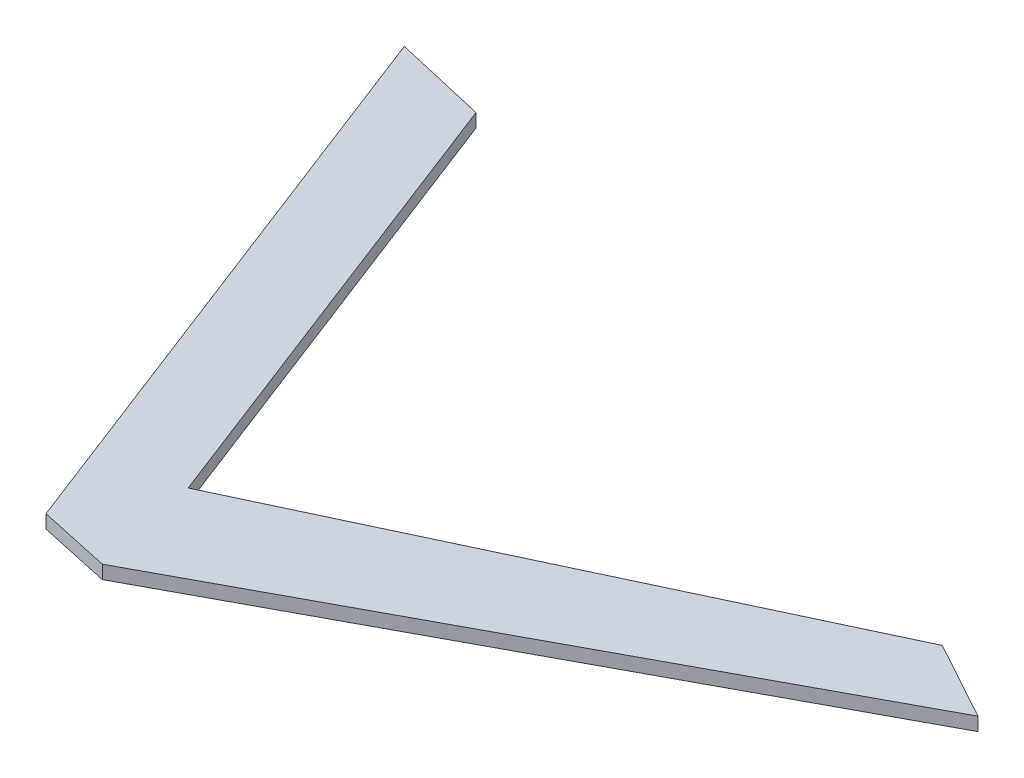
ISO-10303-21;
HEADER;
FILE_DESCRIPTION(('STEP AP214'),'2;1');
FILE_NAME('part.step','',(''),(''),'','','');
FILE_SCHEMA(('AUTOMOTIVE_DESIGN { 1 0 10303 214 1 1 1 1 }'));
ENDSEC;
DATA;
#1=APPLICATION_CONTEXT('core data for automotive mechanical design processes');
#2=APPLICATION_PROTOCOL_DEFINITION('international standard','automotive_design',2000,#1);
#3=PRODUCT_CONTEXT('',#1,'mechanical');
#4=PRODUCT('Part','Part','',(#3));
#5=PRODUCT_RELATED_PRODUCT_CATEGORY('part','',(#4));
#6=PRODUCT_DEFINITION_FORMATION('','',#4);
#7=PRODUCT_DEFINITION_CONTEXT('part definition',#1,'design');
#8=PRODUCT_DEFINITION('design','',#6,#7);
#9=PRODUCT_DEFINITION_SHAPE('','',#8);
#10=(LENGTH_UNIT() NAMED_UNIT(*) SI_UNIT(.MILLI.,.METRE.));
#11=(NAMED_UNIT(*) PLANE_ANGLE_UNIT() SI_UNIT($,.RADIAN.));
#12=(NAMED_UNIT(*) SI_UNIT($,.STERADIAN.) SOLID_ANGLE_UNIT());
#13=UNCERTAINTY_MEASURE_WITH_UNIT(LENGTH_MEASURE(1.E-05),#10,'distance_accuracy_value','');
#14=(GEOMETRIC_REPRESENTATION_CONTEXT(3) GLOBAL_UNCERTAINTY_ASSIGNED_CONTEXT((#13)) GLOBAL_UNIT_ASSIGNED_CONTEXT((#10,
#11,#12)) REPRESENTATION_CONTEXT('',''));
#15=CARTESIAN_POINT('',(0.,0.,0.));
#16=DIRECTION('',(0.,0.,1.));
#17=DIRECTION('',(1.,0.,0.));
#18=AXIS2_PLACEMENT_3D('',#15,#16,#17);
#19=CARTESIAN_POINT('',(38.3897217581824,1.,-17.9997017566774));
#20=DIRECTION('',(0.424521267846164,0.,0.905417965994869));
#21=DIRECTION('',(0.905417965994869,0.,-0.424521267846164));
#22=AXIS2_PLACEMENT_3D('',#19,#20,#21);
#23=PLANE('',#22);
#24=DIRECTION('',(-0.905417965994869,0.,0.424521267846164));
#25=VECTOR('',#24,1.);
#26=CARTESIAN_POINT('',(38.3897217581824,0.,-17.9997017566774));
#27=LINE('',#26,#25);
#28=CARTESIAN_POINT('',(38.3897217581824,0.,-17.9997017566774));
#29=VERTEX_POINT('',#28);
#30=CARTESIAN_POINT('',(0.,0.,0.));
#31=VERTEX_POINT('',#30);
#32=EDGE_CURVE('E134',#29,#31,#27,.T.);
#33=ORIENTED_EDGE('',*,*,#32,.T.);
#34=DIRECTION('',(0.,-1.,0.));
#35=VECTOR('',#34,1.);
#36=CARTESIAN_POINT('',(0.,1.,0.));
#37=LINE('',#36,#35);
#38=CARTESIAN_POINT('',(0.,1.,0.));
#39=VERTEX_POINT('',#38);
#40=EDGE_CURVE('E11',#39,#31,#37,.T.);
#41=ORIENTED_EDGE('',*,*,#40,.F.);
#42=DIRECTION('',(-0.905417965994869,0.,0.424521267846164));
#43=VECTOR('',#42,1.);
#44=CARTESIAN_POINT('',(38.3897217581824,1.,-17.9997017566774));
#45=LINE('',#44,#43);
#46=CARTESIAN_POINT('',(38.3897217581824,1.,-17.9997017566774));
#47=VERTEX_POINT('',#46);
#48=EDGE_CURVE('E153',#47,#39,#45,.T.);
#49=ORIENTED_EDGE('',*,*,#48,.F.);
#50=DIRECTION('',(0.,-1.,0.));
#51=VECTOR('',#50,1.);
#52=CARTESIAN_POINT('',(38.3897217581824,1.,-17.9997017566774));
#53=LINE('',#52,#51);
#54=EDGE_CURVE('E130',#47,#29,#53,.T.);
#55=ORIENTED_EDGE('',*,*,#54,.T.);
#56=EDGE_LOOP('',(#33,#41,#49,#55));
#57=FACE_BOUND('',#56,.T.);
#58=ADVANCED_FACE('F39',(#57),#23,.F.);
#59=CARTESIAN_POINT('',(0.,1.,0.));
#60=DIRECTION('',(-0.932825520010188,0.,0.360328390801671));
#61=DIRECTION('',(0.360328390801671,0.,0.932825520010188));
#62=AXIS2_PLACEMENT_3D('',#59,#60,#61);
#63=PLANE('',#62);
#64=DIRECTION('',(-0.360328390801671,0.,-0.932825520010188));
#65=VECTOR('',#64,1.);
#66=CARTESIAN_POINT('',(0.,0.,0.));
#67=LINE('',#66,#65);
#68=CARTESIAN_POINT('',(-13.5483474941428,0.,-35.0742395523831));
#69=VERTEX_POINT('',#68);
#70=EDGE_CURVE('E138',#31,#69,#67,.T.);
#71=ORIENTED_EDGE('',*,*,#70,.T.);
#72=DIRECTION('',(0.,-1.,0.));
#73=VECTOR('',#72,1.);
#74=CARTESIAN_POINT('',(-13.5483474941428,1.,-35.0742395523831));
#75=LINE('',#74,#73);
#76=CARTESIAN_POINT('',(-13.5483474941428,1.,-35.0742395523831));
#77=VERTEX_POINT('',#76);
#78=EDGE_CURVE('E48',#77,#69,#75,.T.);
#79=ORIENTED_EDGE('',*,*,#78,.F.);
#80=DIRECTION('',(-0.360328390801671,0.,-0.932825520010188));
#81=VECTOR('',#80,1.);
#82=CARTESIAN_POINT('',(0.,1.,0.));
#83=LINE('',#82,#81);
#84=EDGE_CURVE('E96',#39,#77,#83,.T.);
#85=ORIENTED_EDGE('',*,*,#84,.F.);
#86=ORIENTED_EDGE('',*,*,#40,.T.);
#87=EDGE_LOOP('',(#71,#79,#85,#86));
#88=FACE_BOUND('',#87,.T.);
#89=ADVANCED_FACE('F187',(#88),#63,.F.);
#90=CARTESIAN_POINT('',(-13.5483474941428,1.,-35.0742395523831));
#91=DIRECTION('',(-0.224299476468434,0.,0.974520263953493));
#92=DIRECTION('',(0.974520263953493,0.,0.224299476468434));
#93=AXIS2_PLACEMENT_3D('',#90,#91,#92);
#94=PLANE('',#93);
#95=DIRECTION('',(-0.974520263953493,0.,-0.224299476468434));
#96=VECTOR('',#95,1.);
#97=CARTESIAN_POINT('',(-13.5483474941428,0.,-35.0742395523831));
#98=LINE('',#97,#96);
#99=CARTESIAN_POINT('',(-20.5161673814103,0.,-36.6779808091324));
#100=VERTEX_POINT('',#99);
#101=EDGE_CURVE('E141',#69,#100,#98,.T.);
#102=ORIENTED_EDGE('',*,*,#101,.T.);
#103=DIRECTION('',(0.,-1.,0.));
#104=VECTOR('',#103,1.);
#105=CARTESIAN_POINT('',(-20.5161673814103,1.,-36.6779808091324));
#106=LINE('',#105,#104);
#107=CARTESIAN_POINT('',(-20.5161673814103,1.,-36.6779808091324));
#108=VERTEX_POINT('',#107);
#109=EDGE_CURVE('E160',#108,#100,#106,.T.);
#110=ORIENTED_EDGE('',*,*,#109,.F.);
#111=DIRECTION('',(-0.974520263953493,0.,-0.224299476468434));
#112=VECTOR('',#111,1.);
#113=CARTESIAN_POINT('',(-13.5483474941428,1.,-35.0742395523831));
#114=LINE('',#113,#112);
#115=EDGE_CURVE('E170',#77,#108,#114,.T.);
#116=ORIENTED_EDGE('',*,*,#115,.F.);
#117=ORIENTED_EDGE('',*,*,#78,.T.);
#118=EDGE_LOOP('',(#102,#110,#116,#117));
#119=FACE_BOUND('',#118,.T.);
#120=ADVANCED_FACE('F168',(#119),#94,.F.);
#121=CARTESIAN_POINT('',(-20.5161673814103,1.,-36.6779808091324));
#122=DIRECTION('',(0.932825520010188,0.,-0.360328390801671));
#123=DIRECTION('',(-0.360328390801671,0.,-0.932825520010188));
#124=AXIS2_PLACEMENT_3D('',#121,#122,#123);
#125=PLANE('',#124);
#126=DIRECTION('',(0.360328390801671,0.,0.932825520010188));
#127=VECTOR('',#126,1.);
#128=CARTESIAN_POINT('',(-20.5161673814103,0.,-36.6779808091324));
#129=LINE('',#128,#127);
#130=CARTESIAN_POINT('',(-3.6527986918921,0.,6.97825352734443));
#131=VERTEX_POINT('',#130);
#132=EDGE_CURVE('E144',#100,#131,#129,.T.);
#133=ORIENTED_EDGE('',*,*,#132,.T.);
#134=DIRECTION('',(0.,-1.,0.));
#135=VECTOR('',#134,1.);
#136=CARTESIAN_POINT('',(-3.6527986918921,1.,6.97825352734443));
#137=LINE('',#136,#135);
#138=CARTESIAN_POINT('',(-3.6527986918921,1.,6.97825352734443));
#139=VERTEX_POINT('',#138);
#140=EDGE_CURVE('E123',#139,#131,#137,.T.);
#141=ORIENTED_EDGE('',*,*,#140,.F.);
#142=DIRECTION('',(0.360328390801671,0.,0.932825520010188));
#143=VECTOR('',#142,1.);
#144=CARTESIAN_POINT('',(-20.5161673814103,1.,-36.6779808091324));
#145=LINE('',#144,#143);
#146=EDGE_CURVE('E112',#108,#139,#145,.T.);
#147=ORIENTED_EDGE('',*,*,#146,.F.);
#148=ORIENTED_EDGE('',*,*,#109,.T.);
#149=EDGE_LOOP('',(#133,#141,#147,#148));
#150=FACE_BOUND('',#149,.T.);
#151=ADVANCED_FACE('F176',(#150),#125,.F.);
#152=CARTESIAN_POINT('',(-3.6527986918921,1.,6.97825352734443));
#153=DIRECTION('',(0.211896500774172,0.,-0.977292112400208));
#154=DIRECTION('',(-0.977292112400208,0.,-0.211896500774172));
#155=AXIS2_PLACEMENT_3D('',#152,#153,#154);
#156=PLANE('',#155);
#157=DIRECTION('',(0.977292112400208,0.,0.211896500774172));
#158=VECTOR('',#157,1.);
#159=CARTESIAN_POINT('',(-3.6527986918921,0.,6.97825352734443));
#160=LINE('',#159,#158);
#161=CARTESIAN_POINT('',(1.72230792630904,0.,8.14368428160238));
#162=VERTEX_POINT('',#161);
#163=EDGE_CURVE('E121',#131,#162,#160,.T.);
#164=ORIENTED_EDGE('',*,*,#163,.T.);
#165=DIRECTION('',(0.,-1.,0.));
#166=VECTOR('',#165,1.);
#167=CARTESIAN_POINT('',(1.72230792630904,1.,8.14368428160238));
#168=LINE('',#167,#166);
#169=CARTESIAN_POINT('',(1.72230792630904,1.,8.14368428160238));
#170=VERTEX_POINT('',#169);
#171=EDGE_CURVE('E118',#170,#162,#168,.T.);
#172=ORIENTED_EDGE('',*,*,#171,.F.);
#173=DIRECTION('',(0.977292112400208,0.,0.211896500774172));
#174=VECTOR('',#173,1.);
#175=CARTESIAN_POINT('',(-3.6527986918921,1.,6.97825352734443));
#176=LINE('',#175,#174);
#177=EDGE_CURVE('E106',#139,#170,#176,.T.);
#178=ORIENTED_EDGE('',*,*,#177,.F.);
#179=ORIENTED_EDGE('',*,*,#140,.T.);
#180=EDGE_LOOP('',(#164,#172,#178,#179));
#181=FACE_BOUND('',#180,.T.);
#182=ADVANCED_FACE('F119',(#181),#156,.F.);
#183=CARTESIAN_POINT('',(1.72230792630904,1.,8.14368428160238));
#184=DIRECTION('',(-0.473551415780049,0.,-0.880766175901817));
#185=DIRECTION('',(-0.880766175901817,0.,0.473551415780049));
#186=AXIS2_PLACEMENT_3D('',#183,#184,#185);
#187=PLANE('',#186);
#188=DIRECTION('',(0.880766175901817,0.,-0.473551415780049));
#189=VECTOR('',#188,1.);
#190=CARTESIAN_POINT('',(1.72230792630904,0.,8.14368428160238));
#191=LINE('',#190,#189);
#192=CARTESIAN_POINT('',(44.3073525311619,0.,-14.752526671363));
#193=VERTEX_POINT('',#192);
#194=EDGE_CURVE('E82',#162,#193,#191,.T.);
#195=ORIENTED_EDGE('',*,*,#194,.T.);
#196=DIRECTION('',(0.,-1.,0.));
#197=VECTOR('',#196,1.);
#198=CARTESIAN_POINT('',(44.3073525311619,1.,-14.752526671363));
#199=LINE('',#198,#197);
#200=CARTESIAN_POINT('',(44.3073525311619,1.,-14.752526671363));
#201=VERTEX_POINT('',#200);
#202=EDGE_CURVE('E124',#201,#193,#199,.T.);
#203=ORIENTED_EDGE('',*,*,#202,.F.);
#204=DIRECTION('',(0.880766175901817,0.,-0.473551415780049));
#205=VECTOR('',#204,1.);
#206=CARTESIAN_POINT('',(1.72230792630904,1.,8.14368428160238));
#207=LINE('',#206,#205);
#208=EDGE_CURVE('E110',#170,#201,#207,.T.);
#209=ORIENTED_EDGE('',*,*,#208,.F.);
#210=ORIENTED_EDGE('',*,*,#171,.T.);
#211=EDGE_LOOP('',(#195,#203,#209,#210));
#212=FACE_BOUND('',#211,.T.);
#213=ADVANCED_FACE('F126',(#212),#187,.F.);
#214=CARTESIAN_POINT('',(44.3073525311619,1.,-14.752526671363));
#215=DIRECTION('',(-0.481062975602126,0.,0.876686040441405));
#216=DIRECTION('',(0.876686040441405,0.,0.481062975602126));
#217=AXIS2_PLACEMENT_3D('',#214,#215,#216);
#218=PLANE('',#217);
#219=DIRECTION('',(-0.876686040441405,0.,-0.481062975602126));
#220=VECTOR('',#219,1.);
#221=CARTESIAN_POINT('',(44.3073525311619,0.,-14.752526671363));
#222=LINE('',#221,#220);
#223=EDGE_CURVE('E88',#193,#29,#222,.T.);
#224=ORIENTED_EDGE('',*,*,#223,.T.);
#225=ORIENTED_EDGE('',*,*,#54,.F.);
#226=DIRECTION('',(-0.876686040441405,0.,-0.481062975602126));
#227=VECTOR('',#226,1.);
#228=CARTESIAN_POINT('',(44.3073525311619,1.,-14.752526671363));
#229=LINE('',#228,#227);
#230=EDGE_CURVE('E56',#201,#47,#229,.T.);
#231=ORIENTED_EDGE('',*,*,#230,.F.);
#232=ORIENTED_EDGE('',*,*,#202,.T.);
#233=EDGE_LOOP('',(#224,#225,#231,#232));
#234=FACE_BOUND('',#233,.T.);
#235=ADVANCED_FACE('F201',(#234),#218,.F.);
#236=CARTESIAN_POINT('',(0.,1.,0.));
#237=DIRECTION('',(0.,-1.,0.));
#238=DIRECTION('',(0.,0.,-1.));
#239=AXIS2_PLACEMENT_3D('',#236,#237,#238);
#240=PLANE('',#239);
#241=ORIENTED_EDGE('',*,*,#48,.T.);
#242=ORIENTED_EDGE('',*,*,#84,.T.);
#243=ORIENTED_EDGE('',*,*,#115,.T.);
#244=ORIENTED_EDGE('',*,*,#146,.T.);
#245=ORIENTED_EDGE('',*,*,#177,.T.);
#246=ORIENTED_EDGE('',*,*,#208,.T.);
#247=ORIENTED_EDGE('',*,*,#230,.T.);
#248=EDGE_LOOP('',(#241,#242,#243,#244,#245,#246,#247));
#249=FACE_BOUND('',#248,.T.);
#250=ADVANCED_FACE('F108',(#249),#240,.F.);
#251=CARTESIAN_POINT('',(0.,0.,0.));
#252=DIRECTION('',(0.,-1.,0.));
#253=DIRECTION('',(0.,0.,-1.));
#254=AXIS2_PLACEMENT_3D('',#251,#252,#253);
#255=PLANE('',#254);
#256=ORIENTED_EDGE('',*,*,#32,.F.);
#257=ORIENTED_EDGE('',*,*,#223,.F.);
#258=ORIENTED_EDGE('',*,*,#194,.F.);
#259=ORIENTED_EDGE('',*,*,#163,.F.);
#260=ORIENTED_EDGE('',*,*,#132,.F.);
#261=ORIENTED_EDGE('',*,*,#101,.F.);
#262=ORIENTED_EDGE('',*,*,#70,.F.);
#263=EDGE_LOOP('',(#256,#257,#258,#259,#260,#261,#262));
#264=FACE_BOUND('',#263,.T.);
#265=ADVANCED_FACE('F174',(#264),#255,.T.);
#266=CLOSED_SHELL('',(#58,#89,#120,#151,#182,#213,#235,#250,#265));
#267=MANIFOLD_SOLID_BREP('B2',#266);
#268=ADVANCED_BREP_SHAPE_REPRESENTATION('',(#18,#267),#14);
#269=SHAPE_DEFINITION_REPRESENTATION(#9,#268);
ENDSEC;
END-ISO-10303-21;
